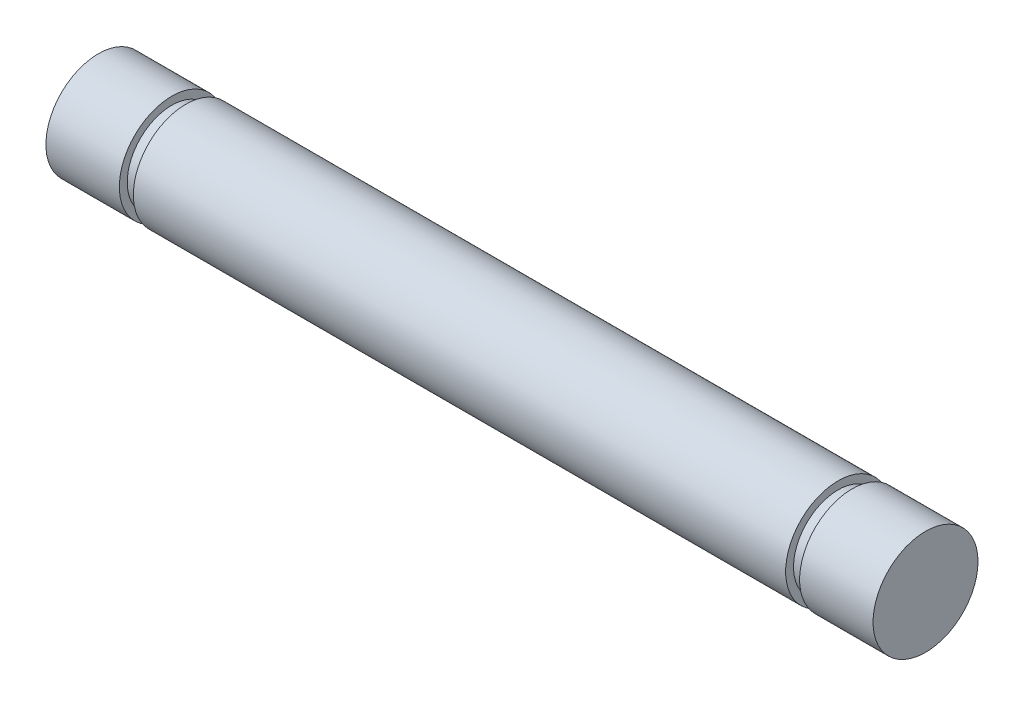
ISO-10303-21;
HEADER;
FILE_DESCRIPTION(('STEP AP214'),'2;1');
FILE_NAME('part.step','',(''),(''),'','','');
FILE_SCHEMA(('AUTOMOTIVE_DESIGN { 1 0 10303 214 1 1 1 1 }'));
ENDSEC;
DATA;
#1=APPLICATION_CONTEXT('core data for automotive mechanical design processes');
#2=APPLICATION_PROTOCOL_DEFINITION('international standard','automotive_design',2000,#1);
#3=PRODUCT_CONTEXT('',#1,'mechanical');
#4=PRODUCT('Part','Part','',(#3));
#5=PRODUCT_RELATED_PRODUCT_CATEGORY('part','',(#4));
#6=PRODUCT_DEFINITION_FORMATION('','',#4);
#7=PRODUCT_DEFINITION_CONTEXT('part definition',#1,'design');
#8=PRODUCT_DEFINITION('design','',#6,#7);
#9=PRODUCT_DEFINITION_SHAPE('','',#8);
#10=(LENGTH_UNIT() NAMED_UNIT(*) SI_UNIT(.MILLI.,.METRE.));
#11=(NAMED_UNIT(*) PLANE_ANGLE_UNIT() SI_UNIT($,.RADIAN.));
#12=(NAMED_UNIT(*) SI_UNIT($,.STERADIAN.) SOLID_ANGLE_UNIT());
#13=UNCERTAINTY_MEASURE_WITH_UNIT(LENGTH_MEASURE(1.E-05),#10,'distance_accuracy_value','');
#14=(GEOMETRIC_REPRESENTATION_CONTEXT(3) GLOBAL_UNCERTAINTY_ASSIGNED_CONTEXT((#13)) GLOBAL_UNIT_ASSIGNED_CONTEXT((#10,
#11,#12)) REPRESENTATION_CONTEXT('',''));
#15=CARTESIAN_POINT('',(0.,0.,0.));
#16=DIRECTION('',(0.,0.,1.));
#17=DIRECTION('',(1.,0.,0.));
#18=AXIS2_PLACEMENT_3D('',#15,#16,#17);
#19=CARTESIAN_POINT('',(23.65,0.,3.));
#20=DIRECTION('',(-1.,0.,0.));
#21=DIRECTION('',(0.,0.,1.));
#22=AXIS2_PLACEMENT_3D('',#19,#20,#21);
#23=PLANE('',#22);
#24=CARTESIAN_POINT('',(23.65,0.,0.));
#25=DIRECTION('',(1.,0.,0.));
#26=DIRECTION('',(0.,0.,-1.));
#27=AXIS2_PLACEMENT_3D('',#24,#25,#26);
#28=CIRCLE('',#27,3.);
#29=CARTESIAN_POINT('',(23.65,0.,-3.));
#30=VERTEX_POINT('',#29);
#31=EDGE_CURVE('E75',#30,#30,#28,.T.);
#32=ORIENTED_EDGE('',*,*,#31,.T.);
#33=EDGE_LOOP('',(#32));
#34=FACE_BOUND('',#33,.T.);
#35=ADVANCED_FACE('F41',(#34),#23,.F.);
#36=CARTESIAN_POINT('',(-23.65,0.,3.));
#37=DIRECTION('',(1.,0.,0.));
#38=DIRECTION('',(0.,0.,-1.));
#39=AXIS2_PLACEMENT_3D('',#36,#37,#38);
#40=PLANE('',#39);
#41=CARTESIAN_POINT('',(-23.65,0.,0.));
#42=DIRECTION('',(1.,0.,0.));
#43=DIRECTION('',(0.,0.,-1.));
#44=AXIS2_PLACEMENT_3D('',#41,#42,#43);
#45=CIRCLE('',#44,3.);
#46=CARTESIAN_POINT('',(-23.65,0.,-3.));
#47=VERTEX_POINT('',#46);
#48=EDGE_CURVE('E10',#47,#47,#45,.T.);
#49=ORIENTED_EDGE('',*,*,#48,.F.);
#50=EDGE_LOOP('',(#49));
#51=FACE_BOUND('',#50,.T.);
#52=ADVANCED_FACE('F129',(#51),#40,.F.);
#53=CARTESIAN_POINT('',(23.65,0.,0.));
#54=DIRECTION('',(1.,0.,0.));
#55=DIRECTION('',(0.,0.,-1.));
#56=AXIS2_PLACEMENT_3D('',#53,#54,#55);
#57=CYLINDRICAL_SURFACE('',#56,3.);
#58=CARTESIAN_POINT('',(-19.45,0.,0.));
#59=DIRECTION('',(1.,0.,0.));
#60=DIRECTION('',(0.,0.,-1.));
#61=AXIS2_PLACEMENT_3D('',#58,#59,#60);
#62=CIRCLE('',#61,3.);
#63=CARTESIAN_POINT('',(-19.45,0.,-3.));
#64=VERTEX_POINT('',#63);
#65=EDGE_CURVE('E47',#64,#64,#62,.T.);
#66=ORIENTED_EDGE('',*,*,#65,.F.);
#67=EDGE_LOOP('',(#66));
#68=FACE_BOUND('',#67,.T.);
#69=ORIENTED_EDGE('',*,*,#48,.T.);
#70=EDGE_LOOP('',(#69));
#71=FACE_BOUND('',#70,.T.);
#72=ADVANCED_FACE('F124',(#68,#71),#57,.T.);
#73=CARTESIAN_POINT('',(-19.45,0.,2.55));
#74=DIRECTION('',(-1.,0.,0.));
#75=DIRECTION('',(0.,0.,1.));
#76=AXIS2_PLACEMENT_3D('',#73,#74,#75);
#77=PLANE('',#76);
#78=CARTESIAN_POINT('',(-19.45,0.,0.));
#79=DIRECTION('',(1.,0.,0.));
#80=DIRECTION('',(0.,0.,-1.));
#81=AXIS2_PLACEMENT_3D('',#78,#79,#80);
#82=CIRCLE('',#81,2.55);
#83=CARTESIAN_POINT('',(-19.45,0.,-2.55));
#84=VERTEX_POINT('',#83);
#85=EDGE_CURVE('E51',#84,#84,#82,.T.);
#86=ORIENTED_EDGE('',*,*,#85,.F.);
#87=EDGE_LOOP('',(#86));
#88=FACE_BOUND('',#87,.T.);
#89=ORIENTED_EDGE('',*,*,#65,.T.);
#90=EDGE_LOOP('',(#89));
#91=FACE_BOUND('',#90,.T.);
#92=ADVANCED_FACE('F119',(#88,#91),#77,.F.);
#93=CARTESIAN_POINT('',(23.65,0.,0.));
#94=DIRECTION('',(1.,0.,0.));
#95=DIRECTION('',(0.,0.,-1.));
#96=AXIS2_PLACEMENT_3D('',#93,#94,#95);
#97=CYLINDRICAL_SURFACE('',#96,2.55);
#98=CARTESIAN_POINT('',(-18.65,0.,0.));
#99=DIRECTION('',(1.,0.,0.));
#100=DIRECTION('',(0.,0.,-1.));
#101=AXIS2_PLACEMENT_3D('',#98,#99,#100);
#102=CIRCLE('',#101,2.55);
#103=CARTESIAN_POINT('',(-18.65,0.,-2.55));
#104=VERTEX_POINT('',#103);
#105=EDGE_CURVE('E55',#104,#104,#102,.T.);
#106=ORIENTED_EDGE('',*,*,#105,.F.);
#107=EDGE_LOOP('',(#106));
#108=FACE_BOUND('',#107,.T.);
#109=ORIENTED_EDGE('',*,*,#85,.T.);
#110=EDGE_LOOP('',(#109));
#111=FACE_BOUND('',#110,.T.);
#112=ADVANCED_FACE('F113',(#108,#111),#97,.T.);
#113=CARTESIAN_POINT('',(-18.65,0.,3.));
#114=DIRECTION('',(1.,0.,0.));
#115=DIRECTION('',(0.,0.,-1.));
#116=AXIS2_PLACEMENT_3D('',#113,#114,#115);
#117=PLANE('',#116);
#118=CARTESIAN_POINT('',(-18.65,0.,0.));
#119=DIRECTION('',(1.,0.,0.));
#120=DIRECTION('',(0.,0.,-1.));
#121=AXIS2_PLACEMENT_3D('',#118,#119,#120);
#122=CIRCLE('',#121,3.);
#123=CARTESIAN_POINT('',(-18.65,0.,-3.));
#124=VERTEX_POINT('',#123);
#125=EDGE_CURVE('E60',#124,#124,#122,.T.);
#126=ORIENTED_EDGE('',*,*,#125,.F.);
#127=EDGE_LOOP('',(#126));
#128=FACE_BOUND('',#127,.T.);
#129=ORIENTED_EDGE('',*,*,#105,.T.);
#130=EDGE_LOOP('',(#129));
#131=FACE_BOUND('',#130,.T.);
#132=ADVANCED_FACE('F107',(#128,#131),#117,.F.);
#133=CARTESIAN_POINT('',(23.65,0.,0.));
#134=DIRECTION('',(1.,0.,0.));
#135=DIRECTION('',(0.,0.,-1.));
#136=AXIS2_PLACEMENT_3D('',#133,#134,#135);
#137=CYLINDRICAL_SURFACE('',#136,3.);
#138=CARTESIAN_POINT('',(18.65,0.,0.));
#139=DIRECTION('',(1.,0.,0.));
#140=DIRECTION('',(0.,0.,-1.));
#141=AXIS2_PLACEMENT_3D('',#138,#139,#140);
#142=CIRCLE('',#141,3.);
#143=CARTESIAN_POINT('',(18.65,0.,-3.));
#144=VERTEX_POINT('',#143);
#145=EDGE_CURVE('E63',#144,#144,#142,.T.);
#146=ORIENTED_EDGE('',*,*,#145,.F.);
#147=EDGE_LOOP('',(#146));
#148=FACE_BOUND('',#147,.T.);
#149=ORIENTED_EDGE('',*,*,#125,.T.);
#150=EDGE_LOOP('',(#149));
#151=FACE_BOUND('',#150,.T.);
#152=ADVANCED_FACE('F101',(#148,#151),#137,.T.);
#153=CARTESIAN_POINT('',(18.65,0.,3.));
#154=DIRECTION('',(-1.,0.,0.));
#155=DIRECTION('',(0.,0.,1.));
#156=AXIS2_PLACEMENT_3D('',#153,#154,#155);
#157=PLANE('',#156);
#158=CARTESIAN_POINT('',(18.65,0.,0.));
#159=DIRECTION('',(1.,0.,0.));
#160=DIRECTION('',(0.,0.,-1.));
#161=AXIS2_PLACEMENT_3D('',#158,#159,#160);
#162=CIRCLE('',#161,2.55);
#163=CARTESIAN_POINT('',(18.65,0.,-2.55));
#164=VERTEX_POINT('',#163);
#165=EDGE_CURVE('E66',#164,#164,#162,.T.);
#166=ORIENTED_EDGE('',*,*,#165,.F.);
#167=EDGE_LOOP('',(#166));
#168=FACE_BOUND('',#167,.T.);
#169=ORIENTED_EDGE('',*,*,#145,.T.);
#170=EDGE_LOOP('',(#169));
#171=FACE_BOUND('',#170,.T.);
#172=ADVANCED_FACE('F95',(#168,#171),#157,.F.);
#173=CARTESIAN_POINT('',(23.65,0.,0.));
#174=DIRECTION('',(1.,0.,0.));
#175=DIRECTION('',(0.,0.,-1.));
#176=AXIS2_PLACEMENT_3D('',#173,#174,#175);
#177=CYLINDRICAL_SURFACE('',#176,2.55);
#178=CARTESIAN_POINT('',(19.45,0.,0.));
#179=DIRECTION('',(1.,0.,0.));
#180=DIRECTION('',(0.,0.,-1.));
#181=AXIS2_PLACEMENT_3D('',#178,#179,#180);
#182=CIRCLE('',#181,2.55);
#183=CARTESIAN_POINT('',(19.45,0.,-2.55));
#184=VERTEX_POINT('',#183);
#185=EDGE_CURVE('E69',#184,#184,#182,.T.);
#186=ORIENTED_EDGE('',*,*,#185,.F.);
#187=EDGE_LOOP('',(#186));
#188=FACE_BOUND('',#187,.T.);
#189=ORIENTED_EDGE('',*,*,#165,.T.);
#190=EDGE_LOOP('',(#189));
#191=FACE_BOUND('',#190,.T.);
#192=ADVANCED_FACE('F89',(#188,#191),#177,.T.);
#193=CARTESIAN_POINT('',(19.45,0.,2.55));
#194=DIRECTION('',(1.,0.,0.));
#195=DIRECTION('',(0.,0.,-1.));
#196=AXIS2_PLACEMENT_3D('',#193,#194,#195);
#197=PLANE('',#196);
#198=CARTESIAN_POINT('',(19.45,0.,0.));
#199=DIRECTION('',(1.,0.,0.));
#200=DIRECTION('',(0.,0.,-1.));
#201=AXIS2_PLACEMENT_3D('',#198,#199,#200);
#202=CIRCLE('',#201,3.);
#203=CARTESIAN_POINT('',(19.45,0.,-3.));
#204=VERTEX_POINT('',#203);
#205=EDGE_CURVE('E72',#204,#204,#202,.T.);
#206=ORIENTED_EDGE('',*,*,#205,.F.);
#207=EDGE_LOOP('',(#206));
#208=FACE_BOUND('',#207,.T.);
#209=ORIENTED_EDGE('',*,*,#185,.T.);
#210=EDGE_LOOP('',(#209));
#211=FACE_BOUND('',#210,.T.);
#212=ADVANCED_FACE('F83',(#208,#211),#197,.F.);
#213=CARTESIAN_POINT('',(23.65,0.,0.));
#214=DIRECTION('',(1.,0.,0.));
#215=DIRECTION('',(0.,0.,-1.));
#216=AXIS2_PLACEMENT_3D('',#213,#214,#215);
#217=CYLINDRICAL_SURFACE('',#216,3.);
#218=ORIENTED_EDGE('',*,*,#31,.F.);
#219=EDGE_LOOP('',(#218));
#220=FACE_BOUND('',#219,.T.);
#221=ORIENTED_EDGE('',*,*,#205,.T.);
#222=EDGE_LOOP('',(#221));
#223=FACE_BOUND('',#222,.T.);
#224=ADVANCED_FACE('F80',(#220,#223),#217,.T.);
#225=CLOSED_SHELL('',(#35,#52,#72,#92,#112,#132,#152,#172,#192,#212,#224));
#226=MANIFOLD_SOLID_BREP('B2',#225);
#227=ADVANCED_BREP_SHAPE_REPRESENTATION('',(#18,#226),#14);
#228=SHAPE_DEFINITION_REPRESENTATION(#9,#227);
ENDSEC;
END-ISO-10303-21;
